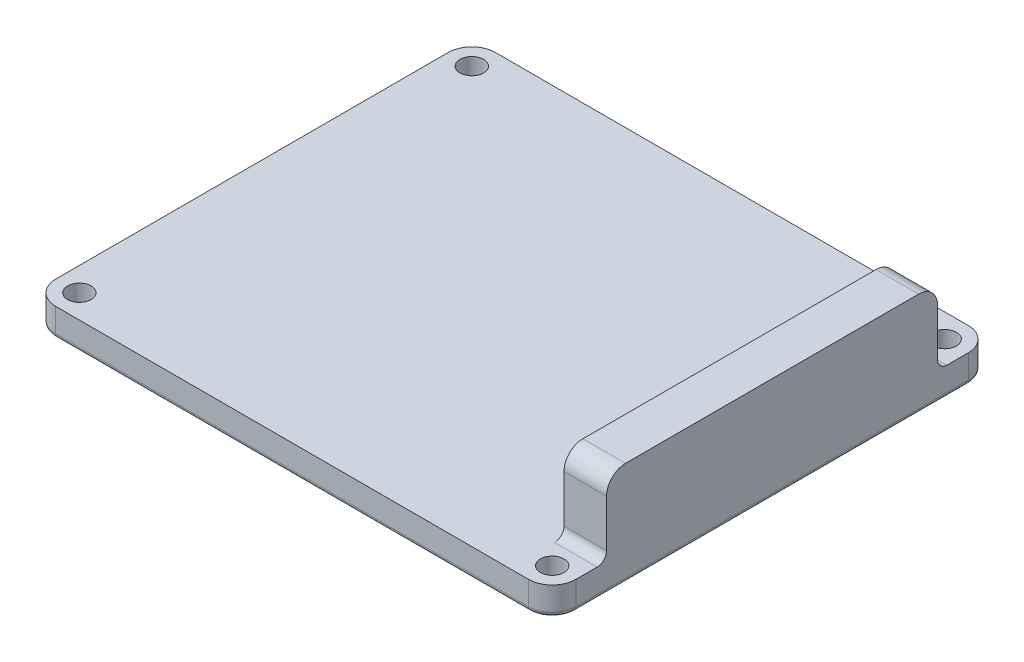
ISO-10303-21;
HEADER;
FILE_DESCRIPTION(('STEP AP214'),'2;1');
FILE_NAME('part.step','',(''),(''),'','','');
FILE_SCHEMA(('AUTOMOTIVE_DESIGN { 1 0 10303 214 1 1 1 1 }'));
ENDSEC;
DATA;
#1=APPLICATION_CONTEXT('core data for automotive mechanical design processes');
#2=APPLICATION_PROTOCOL_DEFINITION('international standard','automotive_design',2000,#1);
#3=PRODUCT_CONTEXT('',#1,'mechanical');
#4=PRODUCT('Part','Part','',(#3));
#5=PRODUCT_RELATED_PRODUCT_CATEGORY('part','',(#4));
#6=PRODUCT_DEFINITION_FORMATION('','',#4);
#7=PRODUCT_DEFINITION_CONTEXT('part definition',#1,'design');
#8=PRODUCT_DEFINITION('design','',#6,#7);
#9=PRODUCT_DEFINITION_SHAPE('','',#8);
#10=(LENGTH_UNIT() NAMED_UNIT(*) SI_UNIT(.MILLI.,.METRE.));
#11=(NAMED_UNIT(*) PLANE_ANGLE_UNIT() SI_UNIT($,.RADIAN.));
#12=(NAMED_UNIT(*) SI_UNIT($,.STERADIAN.) SOLID_ANGLE_UNIT());
#13=UNCERTAINTY_MEASURE_WITH_UNIT(LENGTH_MEASURE(1.E-05),#10,'distance_accuracy_value','');
#14=(GEOMETRIC_REPRESENTATION_CONTEXT(3) GLOBAL_UNCERTAINTY_ASSIGNED_CONTEXT((#13)) GLOBAL_UNIT_ASSIGNED_CONTEXT((#10,
#11,#12)) REPRESENTATION_CONTEXT('',''));
#15=CARTESIAN_POINT('',(0.,0.,0.));
#16=DIRECTION('',(0.,0.,1.));
#17=DIRECTION('',(1.,0.,0.));
#18=AXIS2_PLACEMENT_3D('',#15,#16,#17);
#19=CARTESIAN_POINT('',(-25.,3.,20.75));
#20=DIRECTION('',(0.,1.,0.));
#21=DIRECTION('',(0.,0.,1.));
#22=AXIS2_PLACEMENT_3D('',#19,#20,#21);
#23=PLANE('',#22);
#24=DIRECTION('',(0.,0.,1.));
#25=VECTOR('',#24,1.);
#26=CARTESIAN_POINT('',(23.,3.,-17.5));
#27=LINE('',#26,#25);
#28=CARTESIAN_POINT('',(23.,3.,-18.5));
#29=VERTEX_POINT('',#28);
#30=CARTESIAN_POINT('',(23.,3.,18.5));
#31=VERTEX_POINT('',#30);
#32=EDGE_CURVE('E339',#29,#31,#27,.T.);
#33=ORIENTED_EDGE('',*,*,#32,.F.);
#34=DIRECTION('',(-1.,0.,0.));
#35=VECTOR('',#34,1.);
#36=CARTESIAN_POINT('',(-25.,3.,-18.5));
#37=LINE('',#36,#35);
#38=CARTESIAN_POINT('',(27.5,3.,-18.5));
#39=VERTEX_POINT('',#38);
#40=EDGE_CURVE('E229',#29,#39,#37,.F.);
#41=ORIENTED_EDGE('',*,*,#40,.T.);
#42=DIRECTION('',(0.,0.,-1.));
#43=VECTOR('',#42,1.);
#44=CARTESIAN_POINT('',(27.5,3.,20.75));
#45=LINE('',#44,#43);
#46=CARTESIAN_POINT('',(27.5,3.,-20.75));
#47=VERTEX_POINT('',#46);
#48=EDGE_CURVE('E198',#39,#47,#45,.T.);
#49=ORIENTED_EDGE('',*,*,#48,.T.);
#50=CARTESIAN_POINT('',(25.,3.,-20.75));
#51=DIRECTION('',(0.,1.,0.));
#52=DIRECTION('',(0.,0.,1.));
#53=AXIS2_PLACEMENT_3D('',#50,#51,#52);
#54=CIRCLE('',#53,2.5);
#55=CARTESIAN_POINT('',(25.,3.,-23.25));
#56=VERTEX_POINT('',#55);
#57=EDGE_CURVE('E202',#47,#56,#54,.T.);
#58=ORIENTED_EDGE('',*,*,#57,.T.);
#59=DIRECTION('',(-1.,0.,0.));
#60=VECTOR('',#59,1.);
#61=CARTESIAN_POINT('',(25.,3.,-23.25));
#62=LINE('',#61,#60);
#63=CARTESIAN_POINT('',(-25.,3.,-23.25));
#64=VERTEX_POINT('',#63);
#65=EDGE_CURVE('E204',#56,#64,#62,.T.);
#66=ORIENTED_EDGE('',*,*,#65,.T.);
#67=CARTESIAN_POINT('',(-25.,3.,-20.75));
#68=DIRECTION('',(0.,1.,0.));
#69=DIRECTION('',(0.,0.,1.));
#70=AXIS2_PLACEMENT_3D('',#67,#68,#69);
#71=CIRCLE('',#70,2.5);
#72=CARTESIAN_POINT('',(-27.5,3.,-20.75));
#73=VERTEX_POINT('',#72);
#74=EDGE_CURVE('E178',#64,#73,#71,.T.);
#75=ORIENTED_EDGE('',*,*,#74,.T.);
#76=DIRECTION('',(0.,0.,1.));
#77=VECTOR('',#76,1.);
#78=CARTESIAN_POINT('',(-27.5,3.,-19.25));
#79=LINE('',#78,#77);
#80=CARTESIAN_POINT('',(-27.5,3.,20.75));
#81=VERTEX_POINT('',#80);
#82=EDGE_CURVE('E172',#73,#81,#79,.T.);
#83=ORIENTED_EDGE('',*,*,#82,.T.);
#84=CARTESIAN_POINT('',(-25.,3.,20.75));
#85=DIRECTION('',(0.,1.,0.));
#86=DIRECTION('',(0.,0.,1.));
#87=AXIS2_PLACEMENT_3D('',#84,#85,#86);
#88=CIRCLE('',#87,2.5);
#89=CARTESIAN_POINT('',(-25.,3.,23.25));
#90=VERTEX_POINT('',#89);
#91=EDGE_CURVE('E175',#81,#90,#88,.T.);
#92=ORIENTED_EDGE('',*,*,#91,.T.);
#93=DIRECTION('',(1.,0.,0.));
#94=VECTOR('',#93,1.);
#95=CARTESIAN_POINT('',(-25.,3.,23.25));
#96=LINE('',#95,#94);
#97=CARTESIAN_POINT('',(25.,3.,23.25));
#98=VERTEX_POINT('',#97);
#99=EDGE_CURVE('E191',#90,#98,#96,.T.);
#100=ORIENTED_EDGE('',*,*,#99,.T.);
#101=CARTESIAN_POINT('',(25.,3.,20.75));
#102=DIRECTION('',(0.,1.,0.));
#103=DIRECTION('',(0.,0.,1.));
#104=AXIS2_PLACEMENT_3D('',#101,#102,#103);
#105=CIRCLE('',#104,2.5);
#106=CARTESIAN_POINT('',(27.5,3.,20.75));
#107=VERTEX_POINT('',#106);
#108=EDGE_CURVE('E193',#98,#107,#105,.T.);
#109=ORIENTED_EDGE('',*,*,#108,.T.);
#110=CARTESIAN_POINT('',(27.5,3.,18.5));
#111=VERTEX_POINT('',#110);
#112=EDGE_CURVE('E199',#107,#111,#45,.T.);
#113=ORIENTED_EDGE('',*,*,#112,.T.);
#114=DIRECTION('',(1.,0.,0.));
#115=VECTOR('',#114,1.);
#116=CARTESIAN_POINT('',(-25.,3.,18.5));
#117=LINE('',#116,#115);
#118=EDGE_CURVE('E226',#111,#31,#117,.F.);
#119=ORIENTED_EDGE('',*,*,#118,.T.);
#120=EDGE_LOOP('',(#33,#41,#49,#58,#66,#75,#83,#92,#100,#109,#113,#119));
#121=FACE_BOUND('',#120,.T.);
#122=CARTESIAN_POINT('',(25.,3.,-20.75));
#123=DIRECTION('',(0.,1.,0.));
#124=DIRECTION('',(0.,0.,1.));
#125=AXIS2_PLACEMENT_3D('',#122,#123,#124);
#126=CIRCLE('',#125,1.25);
#127=CARTESIAN_POINT('',(25.,3.,-19.5));
#128=VERTEX_POINT('',#127);
#129=EDGE_CURVE('E362',#128,#128,#126,.T.);
#130=ORIENTED_EDGE('',*,*,#129,.F.);
#131=EDGE_LOOP('',(#130));
#132=FACE_BOUND('',#131,.T.);
#133=CARTESIAN_POINT('',(-25.,3.,20.75));
#134=DIRECTION('',(0.,1.,0.));
#135=DIRECTION('',(0.,0.,1.));
#136=AXIS2_PLACEMENT_3D('',#133,#134,#135);
#137=CIRCLE('',#136,1.25);
#138=CARTESIAN_POINT('',(-25.,3.,22.));
#139=VERTEX_POINT('',#138);
#140=EDGE_CURVE('E179',#139,#139,#137,.T.);
#141=ORIENTED_EDGE('',*,*,#140,.F.);
#142=EDGE_LOOP('',(#141));
#143=FACE_BOUND('',#142,.T.);
#144=CARTESIAN_POINT('',(25.,3.,20.75));
#145=DIRECTION('',(0.,1.,0.));
#146=DIRECTION('',(0.,0.,1.));
#147=AXIS2_PLACEMENT_3D('',#144,#145,#146);
#148=CIRCLE('',#147,1.25);
#149=CARTESIAN_POINT('',(25.,3.,22.));
#150=VERTEX_POINT('',#149);
#151=EDGE_CURVE('E365',#150,#150,#148,.T.);
#152=ORIENTED_EDGE('',*,*,#151,.F.);
#153=EDGE_LOOP('',(#152));
#154=FACE_BOUND('',#153,.T.);
#155=CARTESIAN_POINT('',(-25.,3.,-20.75));
#156=DIRECTION('',(0.,1.,0.));
#157=DIRECTION('',(0.,0.,1.));
#158=AXIS2_PLACEMENT_3D('',#155,#156,#157);
#159=CIRCLE('',#158,1.25);
#160=CARTESIAN_POINT('',(-25.,3.,-19.5));
#161=VERTEX_POINT('',#160);
#162=EDGE_CURVE('E359',#161,#161,#159,.T.);
#163=ORIENTED_EDGE('',*,*,#162,.F.);
#164=EDGE_LOOP('',(#163));
#165=FACE_BOUND('',#164,.T.);
#166=ADVANCED_FACE('F33',(#121,#132,#143,#154,#165),#23,.T.);
#167=CARTESIAN_POINT('',(-25.,0.,20.75));
#168=DIRECTION('',(0.,1.,0.));
#169=DIRECTION('',(0.,0.,1.));
#170=AXIS2_PLACEMENT_3D('',#167,#168,#169);
#171=PLANE('',#170);
#172=CARTESIAN_POINT('',(-25.,0.,-20.75));
#173=DIRECTION('',(0.,1.,0.));
#174=DIRECTION('',(0.,0.,1.));
#175=AXIS2_PLACEMENT_3D('',#172,#173,#174);
#176=CIRCLE('',#175,1.75);
#177=CARTESIAN_POINT('',(-25.,0.,-19.));
#178=VERTEX_POINT('',#177);
#179=EDGE_CURVE('E289',#178,#178,#176,.T.);
#180=ORIENTED_EDGE('',*,*,#179,.T.);
#181=EDGE_LOOP('',(#180));
#182=FACE_BOUND('',#181,.T.);
#183=CARTESIAN_POINT('',(25.,0.,-20.75));
#184=DIRECTION('',(0.,1.,0.));
#185=DIRECTION('',(0.,0.,1.));
#186=AXIS2_PLACEMENT_3D('',#183,#184,#185);
#187=CIRCLE('',#186,1.75);
#188=CARTESIAN_POINT('',(25.,0.,-19.));
#189=VERTEX_POINT('',#188);
#190=EDGE_CURVE('E286',#189,#189,#187,.T.);
#191=ORIENTED_EDGE('',*,*,#190,.T.);
#192=EDGE_LOOP('',(#191));
#193=FACE_BOUND('',#192,.T.);
#194=CARTESIAN_POINT('',(25.,0.,20.75));
#195=DIRECTION('',(0.,1.,0.));
#196=DIRECTION('',(0.,0.,1.));
#197=AXIS2_PLACEMENT_3D('',#194,#195,#196);
#198=CIRCLE('',#197,1.75);
#199=CARTESIAN_POINT('',(25.,0.,22.5));
#200=VERTEX_POINT('',#199);
#201=EDGE_CURVE('E283',#200,#200,#198,.T.);
#202=ORIENTED_EDGE('',*,*,#201,.T.);
#203=EDGE_LOOP('',(#202));
#204=FACE_BOUND('',#203,.T.);
#205=CARTESIAN_POINT('',(-25.,0.,20.75));
#206=DIRECTION('',(0.,1.,0.));
#207=DIRECTION('',(0.,0.,1.));
#208=AXIS2_PLACEMENT_3D('',#205,#206,#207);
#209=CIRCLE('',#208,1.75);
#210=CARTESIAN_POINT('',(-25.,0.,22.5));
#211=VERTEX_POINT('',#210);
#212=EDGE_CURVE('E280',#211,#211,#209,.T.);
#213=ORIENTED_EDGE('',*,*,#212,.T.);
#214=EDGE_LOOP('',(#213));
#215=FACE_BOUND('',#214,.T.);
#216=CARTESIAN_POINT('',(25.,0.,20.75));
#217=DIRECTION('',(0.,1.,0.));
#218=DIRECTION('',(0.,0.,1.));
#219=AXIS2_PLACEMENT_3D('',#216,#217,#218);
#220=CIRCLE('',#219,2.);
#221=CARTESIAN_POINT('',(27.,0.,20.75));
#222=VERTEX_POINT('',#221);
#223=CARTESIAN_POINT('',(25.,0.,22.75));
#224=VERTEX_POINT('',#223);
#225=EDGE_CURVE('E275',#222,#224,#220,.F.);
#226=ORIENTED_EDGE('',*,*,#225,.T.);
#227=DIRECTION('',(1.,0.,0.));
#228=VECTOR('',#227,1.);
#229=CARTESIAN_POINT('',(-25.,0.,22.75));
#230=LINE('',#229,#228);
#231=CARTESIAN_POINT('',(-25.,0.,22.75));
#232=VERTEX_POINT('',#231);
#233=EDGE_CURVE('E277',#224,#232,#230,.F.);
#234=ORIENTED_EDGE('',*,*,#233,.T.);
#235=CARTESIAN_POINT('',(-25.,0.,20.75));
#236=DIRECTION('',(0.,1.,0.));
#237=DIRECTION('',(0.,0.,1.));
#238=AXIS2_PLACEMENT_3D('',#235,#236,#237);
#239=CIRCLE('',#238,2.);
#240=CARTESIAN_POINT('',(-27.,0.,20.75));
#241=VERTEX_POINT('',#240);
#242=EDGE_CURVE('E263',#232,#241,#239,.F.);
#243=ORIENTED_EDGE('',*,*,#242,.T.);
#244=DIRECTION('',(0.,0.,1.));
#245=VECTOR('',#244,1.);
#246=CARTESIAN_POINT('',(-27.,0.,20.75));
#247=LINE('',#246,#245);
#248=CARTESIAN_POINT('',(-27.,0.,-20.75));
#249=VERTEX_POINT('',#248);
#250=EDGE_CURVE('E265',#241,#249,#247,.F.);
#251=ORIENTED_EDGE('',*,*,#250,.T.);
#252=CARTESIAN_POINT('',(-25.,0.,-20.75));
#253=DIRECTION('',(0.,1.,0.));
#254=DIRECTION('',(0.,0.,1.));
#255=AXIS2_PLACEMENT_3D('',#252,#253,#254);
#256=CIRCLE('',#255,2.);
#257=CARTESIAN_POINT('',(-25.,0.,-22.75));
#258=VERTEX_POINT('',#257);
#259=EDGE_CURVE('E267',#249,#258,#256,.F.);
#260=ORIENTED_EDGE('',*,*,#259,.T.);
#261=DIRECTION('',(-1.,0.,0.));
#262=VECTOR('',#261,1.);
#263=CARTESIAN_POINT('',(-25.,0.,-22.75));
#264=LINE('',#263,#262);
#265=CARTESIAN_POINT('',(25.,0.,-22.75));
#266=VERTEX_POINT('',#265);
#267=EDGE_CURVE('E269',#258,#266,#264,.F.);
#268=ORIENTED_EDGE('',*,*,#267,.T.);
#269=CARTESIAN_POINT('',(25.,0.,-20.75));
#270=DIRECTION('',(0.,1.,0.));
#271=DIRECTION('',(0.,0.,1.));
#272=AXIS2_PLACEMENT_3D('',#269,#270,#271);
#273=CIRCLE('',#272,2.);
#274=CARTESIAN_POINT('',(27.,0.,-20.75));
#275=VERTEX_POINT('',#274);
#276=EDGE_CURVE('E271',#266,#275,#273,.F.);
#277=ORIENTED_EDGE('',*,*,#276,.T.);
#278=DIRECTION('',(0.,0.,-1.));
#279=VECTOR('',#278,1.);
#280=CARTESIAN_POINT('',(27.,0.,20.75));
#281=LINE('',#280,#279);
#282=EDGE_CURVE('E273',#275,#222,#281,.F.);
#283=ORIENTED_EDGE('',*,*,#282,.T.);
#284=EDGE_LOOP('',(#226,#234,#243,#251,#260,#268,#277,#283));
#285=FACE_BOUND('',#284,.T.);
#286=ADVANCED_FACE('F374',(#182,#193,#204,#215,#285),#171,.F.);
#287=CARTESIAN_POINT('',(-25.,3.,20.75));
#288=DIRECTION('',(0.,-1.,0.));
#289=DIRECTION('',(0.,0.,-1.));
#290=AXIS2_PLACEMENT_3D('',#287,#288,#289);
#291=CYLINDRICAL_SURFACE('',#290,2.5);
#292=DIRECTION('',(0.,-1.,0.));
#293=VECTOR('',#292,1.);
#294=CARTESIAN_POINT('',(-27.5,3.,20.75));
#295=LINE('',#294,#293);
#296=CARTESIAN_POINT('',(-27.5,0.5,20.75));
#297=VERTEX_POINT('',#296);
#298=EDGE_CURVE('E181',#81,#297,#295,.T.);
#299=ORIENTED_EDGE('',*,*,#298,.T.);
#300=CARTESIAN_POINT('',(-25.,0.5,20.75));
#301=DIRECTION('',(0.,1.,0.));
#302=DIRECTION('',(0.,0.,1.));
#303=AXIS2_PLACEMENT_3D('',#300,#301,#302);
#304=CIRCLE('',#303,2.5);
#305=CARTESIAN_POINT('',(-25.,0.5,23.25));
#306=VERTEX_POINT('',#305);
#307=EDGE_CURVE('E11',#297,#306,#304,.T.);
#308=ORIENTED_EDGE('',*,*,#307,.T.);
#309=DIRECTION('',(0.,-1.,0.));
#310=VECTOR('',#309,1.);
#311=CARTESIAN_POINT('',(-25.,3.,23.25));
#312=LINE('',#311,#310);
#313=EDGE_CURVE('E186',#90,#306,#312,.T.);
#314=ORIENTED_EDGE('',*,*,#313,.F.);
#315=ORIENTED_EDGE('',*,*,#91,.F.);
#316=EDGE_LOOP('',(#299,#308,#314,#315));
#317=FACE_BOUND('',#316,.T.);
#318=ADVANCED_FACE('F188',(#317),#291,.T.);
#319=CARTESIAN_POINT('',(-25.,3.,23.25));
#320=DIRECTION('',(0.,0.,-1.));
#321=DIRECTION('',(-1.,0.,0.));
#322=AXIS2_PLACEMENT_3D('',#319,#320,#321);
#323=PLANE('',#322);
#324=ORIENTED_EDGE('',*,*,#313,.T.);
#325=DIRECTION('',(1.,0.,0.));
#326=VECTOR('',#325,1.);
#327=CARTESIAN_POINT('',(-25.,0.5,23.25));
#328=LINE('',#327,#326);
#329=CARTESIAN_POINT('',(25.,0.5,23.25));
#330=VERTEX_POINT('',#329);
#331=EDGE_CURVE('E304',#306,#330,#328,.T.);
#332=ORIENTED_EDGE('',*,*,#331,.T.);
#333=DIRECTION('',(0.,-1.,0.));
#334=VECTOR('',#333,1.);
#335=CARTESIAN_POINT('',(25.,3.,23.25));
#336=LINE('',#335,#334);
#337=EDGE_CURVE('E220',#98,#330,#336,.T.);
#338=ORIENTED_EDGE('',*,*,#337,.F.);
#339=ORIENTED_EDGE('',*,*,#99,.F.);
#340=EDGE_LOOP('',(#324,#332,#338,#339));
#341=FACE_BOUND('',#340,.T.);
#342=ADVANCED_FACE('F428',(#341),#323,.F.);
#343=CARTESIAN_POINT('',(25.,3.,20.75));
#344=DIRECTION('',(0.,-1.,0.));
#345=DIRECTION('',(0.,0.,-1.));
#346=AXIS2_PLACEMENT_3D('',#343,#344,#345);
#347=CYLINDRICAL_SURFACE('',#346,2.5);
#348=ORIENTED_EDGE('',*,*,#337,.T.);
#349=CARTESIAN_POINT('',(25.,0.5,20.75));
#350=DIRECTION('',(0.,1.,0.));
#351=DIRECTION('',(0.,0.,1.));
#352=AXIS2_PLACEMENT_3D('',#349,#350,#351);
#353=CIRCLE('',#352,2.5);
#354=CARTESIAN_POINT('',(27.5,0.5,20.75));
#355=VERTEX_POINT('',#354);
#356=EDGE_CURVE('E307',#330,#355,#353,.T.);
#357=ORIENTED_EDGE('',*,*,#356,.T.);
#358=DIRECTION('',(0.,-1.,0.));
#359=VECTOR('',#358,1.);
#360=CARTESIAN_POINT('',(27.5,3.,20.75));
#361=LINE('',#360,#359);
#362=EDGE_CURVE('E217',#107,#355,#361,.T.);
#363=ORIENTED_EDGE('',*,*,#362,.F.);
#364=ORIENTED_EDGE('',*,*,#108,.F.);
#365=EDGE_LOOP('',(#348,#357,#363,#364));
#366=FACE_BOUND('',#365,.T.);
#367=ADVANCED_FACE('F424',(#366),#347,.T.);
#368=CARTESIAN_POINT('',(27.5,3.,20.75));
#369=DIRECTION('',(-1.,0.,0.));
#370=DIRECTION('',(0.,0.,1.));
#371=AXIS2_PLACEMENT_3D('',#368,#369,#370);
#372=PLANE('',#371);
#373=ORIENTED_EDGE('',*,*,#362,.T.);
#374=DIRECTION('',(0.,0.,-1.));
#375=VECTOR('',#374,1.);
#376=CARTESIAN_POINT('',(27.5,0.5,20.75));
#377=LINE('',#376,#375);
#378=CARTESIAN_POINT('',(27.5,0.5,-20.75));
#379=VERTEX_POINT('',#378);
#380=EDGE_CURVE('E309',#355,#379,#377,.T.);
#381=ORIENTED_EDGE('',*,*,#380,.T.);
#382=DIRECTION('',(0.,-1.,0.));
#383=VECTOR('',#382,1.);
#384=CARTESIAN_POINT('',(27.5,3.,-20.75));
#385=LINE('',#384,#383);
#386=EDGE_CURVE('E214',#47,#379,#385,.T.);
#387=ORIENTED_EDGE('',*,*,#386,.F.);
#388=ORIENTED_EDGE('',*,*,#48,.F.);
#389=CARTESIAN_POINT('',(27.5,4.,-18.5));
#390=DIRECTION('',(-1.,0.,0.));
#391=DIRECTION('',(0.,0.,1.));
#392=AXIS2_PLACEMENT_3D('',#389,#390,#391);
#393=CIRCLE('',#392,1.);
#394=CARTESIAN_POINT('',(27.5,4.,-17.5));
#395=VERTEX_POINT('',#394);
#396=EDGE_CURVE('E237',#39,#395,#393,.T.);
#397=ORIENTED_EDGE('',*,*,#396,.T.);
#398=DIRECTION('',(0.,-1.,0.));
#399=VECTOR('',#398,1.);
#400=CARTESIAN_POINT('',(27.5,11.,-17.5));
#401=LINE('',#400,#399);
#402=CARTESIAN_POINT('',(27.5,9.,-17.5));
#403=VERTEX_POINT('',#402);
#404=EDGE_CURVE('E357',#403,#395,#401,.T.);
#405=ORIENTED_EDGE('',*,*,#404,.F.);
#406=CARTESIAN_POINT('',(27.5,9.,-15.5));
#407=DIRECTION('',(-1.,0.,0.));
#408=DIRECTION('',(0.,0.,1.));
#409=AXIS2_PLACEMENT_3D('',#406,#407,#408);
#410=CIRCLE('',#409,2.);
#411=CARTESIAN_POINT('',(27.5,11.,-15.5));
#412=VERTEX_POINT('',#411);
#413=EDGE_CURVE('E251',#403,#412,#410,.F.);
#414=ORIENTED_EDGE('',*,*,#413,.T.);
#415=DIRECTION('',(0.,0.,-1.));
#416=VECTOR('',#415,1.);
#417=CARTESIAN_POINT('',(27.5,11.,-17.5));
#418=LINE('',#417,#416);
#419=CARTESIAN_POINT('',(27.5,11.,15.5));
#420=VERTEX_POINT('',#419);
#421=EDGE_CURVE('E343',#420,#412,#418,.T.);
#422=ORIENTED_EDGE('',*,*,#421,.F.);
#423=CARTESIAN_POINT('',(27.5,9.,15.5));
#424=DIRECTION('',(-1.,0.,0.));
#425=DIRECTION('',(0.,0.,1.));
#426=AXIS2_PLACEMENT_3D('',#423,#424,#425);
#427=CIRCLE('',#426,2.);
#428=CARTESIAN_POINT('',(27.5,9.,17.5));
#429=VERTEX_POINT('',#428);
#430=EDGE_CURVE('E253',#420,#429,#427,.F.);
#431=ORIENTED_EDGE('',*,*,#430,.T.);
#432=DIRECTION('',(0.,-1.,0.));
#433=VECTOR('',#432,1.);
#434=CARTESIAN_POINT('',(27.5,11.,17.5));
#435=LINE('',#434,#433);
#436=CARTESIAN_POINT('',(27.5,4.,17.5));
#437=VERTEX_POINT('',#436);
#438=EDGE_CURVE('E351',#429,#437,#435,.T.);
#439=ORIENTED_EDGE('',*,*,#438,.T.);
#440=CARTESIAN_POINT('',(27.5,4.,18.5));
#441=DIRECTION('',(-1.,0.,0.));
#442=DIRECTION('',(0.,0.,1.));
#443=AXIS2_PLACEMENT_3D('',#440,#441,#442);
#444=CIRCLE('',#443,1.);
#445=EDGE_CURVE('E240',#437,#111,#444,.T.);
#446=ORIENTED_EDGE('',*,*,#445,.T.);
#447=ORIENTED_EDGE('',*,*,#112,.F.);
#448=EDGE_LOOP('',(#373,#381,#387,#388,#397,#405,#414,#422,#431,#439,#446,#447));
#449=FACE_BOUND('',#448,.T.);
#450=ADVANCED_FACE('F420',(#449),#372,.F.);
#451=CARTESIAN_POINT('',(25.,3.,-20.75));
#452=DIRECTION('',(0.,-1.,0.));
#453=DIRECTION('',(0.,0.,-1.));
#454=AXIS2_PLACEMENT_3D('',#451,#452,#453);
#455=CYLINDRICAL_SURFACE('',#454,2.5);
#456=ORIENTED_EDGE('',*,*,#386,.T.);
#457=CARTESIAN_POINT('',(25.,0.5,-20.75));
#458=DIRECTION('',(0.,1.,0.));
#459=DIRECTION('',(0.,0.,1.));
#460=AXIS2_PLACEMENT_3D('',#457,#458,#459);
#461=CIRCLE('',#460,2.5);
#462=CARTESIAN_POINT('',(25.,0.5,-23.25));
#463=VERTEX_POINT('',#462);
#464=EDGE_CURVE('E311',#379,#463,#461,.T.);
#465=ORIENTED_EDGE('',*,*,#464,.T.);
#466=DIRECTION('',(0.,-1.,0.));
#467=VECTOR('',#466,1.);
#468=CARTESIAN_POINT('',(25.,3.,-23.25));
#469=LINE('',#468,#467);
#470=EDGE_CURVE('E211',#56,#463,#469,.T.);
#471=ORIENTED_EDGE('',*,*,#470,.F.);
#472=ORIENTED_EDGE('',*,*,#57,.F.);
#473=EDGE_LOOP('',(#456,#465,#471,#472));
#474=FACE_BOUND('',#473,.T.);
#475=ADVANCED_FACE('F416',(#474),#455,.T.);
#476=CARTESIAN_POINT('',(25.,3.,-23.25));
#477=DIRECTION('',(0.,0.,1.));
#478=DIRECTION('',(1.,0.,0.));
#479=AXIS2_PLACEMENT_3D('',#476,#477,#478);
#480=PLANE('',#479);
#481=ORIENTED_EDGE('',*,*,#470,.T.);
#482=DIRECTION('',(-1.,0.,0.));
#483=VECTOR('',#482,1.);
#484=CARTESIAN_POINT('',(25.,0.5,-23.25));
#485=LINE('',#484,#483);
#486=CARTESIAN_POINT('',(-25.,0.5,-23.25));
#487=VERTEX_POINT('',#486);
#488=EDGE_CURVE('E313',#463,#487,#485,.T.);
#489=ORIENTED_EDGE('',*,*,#488,.T.);
#490=DIRECTION('',(0.,-1.,0.));
#491=VECTOR('',#490,1.);
#492=CARTESIAN_POINT('',(-25.,3.,-23.25));
#493=LINE('',#492,#491);
#494=EDGE_CURVE('E209',#64,#487,#493,.T.);
#495=ORIENTED_EDGE('',*,*,#494,.F.);
#496=ORIENTED_EDGE('',*,*,#65,.F.);
#497=EDGE_LOOP('',(#481,#489,#495,#496));
#498=FACE_BOUND('',#497,.T.);
#499=ADVANCED_FACE('F413',(#498),#480,.F.);
#500=CARTESIAN_POINT('',(-25.,3.,-20.75));
#501=DIRECTION('',(0.,-1.,0.));
#502=DIRECTION('',(0.,0.,-1.));
#503=AXIS2_PLACEMENT_3D('',#500,#501,#502);
#504=CYLINDRICAL_SURFACE('',#503,2.5);
#505=ORIENTED_EDGE('',*,*,#494,.T.);
#506=CARTESIAN_POINT('',(-25.,0.5,-20.75));
#507=DIRECTION('',(0.,1.,0.));
#508=DIRECTION('',(0.,0.,1.));
#509=AXIS2_PLACEMENT_3D('',#506,#507,#508);
#510=CIRCLE('',#509,2.5);
#511=CARTESIAN_POINT('',(-27.5,0.5,-20.75));
#512=VERTEX_POINT('',#511);
#513=EDGE_CURVE('E57',#487,#512,#510,.T.);
#514=ORIENTED_EDGE('',*,*,#513,.T.);
#515=DIRECTION('',(0.,-1.,0.));
#516=VECTOR('',#515,1.);
#517=CARTESIAN_POINT('',(-27.5,3.,-20.75));
#518=LINE('',#517,#516);
#519=EDGE_CURVE('E207',#73,#512,#518,.T.);
#520=ORIENTED_EDGE('',*,*,#519,.F.);
#521=ORIENTED_EDGE('',*,*,#74,.F.);
#522=EDGE_LOOP('',(#505,#514,#520,#521));
#523=FACE_BOUND('',#522,.T.);
#524=ADVANCED_FACE('F410',(#523),#504,.T.);
#525=CARTESIAN_POINT('',(-27.5,3.,-20.75));
#526=DIRECTION('',(1.,0.,0.));
#527=DIRECTION('',(0.,0.,-1.));
#528=AXIS2_PLACEMENT_3D('',#525,#526,#527);
#529=PLANE('',#528);
#530=ORIENTED_EDGE('',*,*,#519,.T.);
#531=DIRECTION('',(0.,0.,1.));
#532=VECTOR('',#531,1.);
#533=CARTESIAN_POINT('',(-27.5,0.5,-20.75));
#534=LINE('',#533,#532);
#535=EDGE_CURVE('E42',#512,#297,#534,.T.);
#536=ORIENTED_EDGE('',*,*,#535,.T.);
#537=ORIENTED_EDGE('',*,*,#298,.F.);
#538=ORIENTED_EDGE('',*,*,#82,.F.);
#539=EDGE_LOOP('',(#530,#536,#537,#538));
#540=FACE_BOUND('',#539,.T.);
#541=ADVANCED_FACE('F182',(#540),#529,.F.);
#542=CARTESIAN_POINT('',(-25.,3.,20.75));
#543=DIRECTION('',(0.,-1.,0.));
#544=DIRECTION('',(0.,0.,-1.));
#545=AXIS2_PLACEMENT_3D('',#542,#543,#544);
#546=CYLINDRICAL_SURFACE('',#545,1.25);
#547=CARTESIAN_POINT('',(-25.,0.5,20.75));
#548=DIRECTION('',(0.,1.,0.));
#549=DIRECTION('',(0.,0.,1.));
#550=AXIS2_PLACEMENT_3D('',#547,#548,#549);
#551=CIRCLE('',#550,1.25);
#552=CARTESIAN_POINT('',(-25.,0.5,22.));
#553=VERTEX_POINT('',#552);
#554=EDGE_CURVE('E301',#553,#553,#551,.F.);
#555=ORIENTED_EDGE('',*,*,#554,.T.);
#556=EDGE_LOOP('',(#555));
#557=FACE_BOUND('',#556,.T.);
#558=ORIENTED_EDGE('',*,*,#140,.T.);
#559=EDGE_LOOP('',(#558));
#560=FACE_BOUND('',#559,.T.);
#561=ADVANCED_FACE('F370',(#557,#560),#546,.F.);
#562=CARTESIAN_POINT('',(25.,3.,20.75));
#563=DIRECTION('',(0.,-1.,0.));
#564=DIRECTION('',(0.,0.,-1.));
#565=AXIS2_PLACEMENT_3D('',#562,#563,#564);
#566=CYLINDRICAL_SURFACE('',#565,1.25);
#567=CARTESIAN_POINT('',(25.,0.5,20.75));
#568=DIRECTION('',(0.,1.,0.));
#569=DIRECTION('',(0.,0.,1.));
#570=AXIS2_PLACEMENT_3D('',#567,#568,#569);
#571=CIRCLE('',#570,1.25);
#572=CARTESIAN_POINT('',(25.,0.5,22.));
#573=VERTEX_POINT('',#572);
#574=EDGE_CURVE('E298',#573,#573,#571,.F.);
#575=ORIENTED_EDGE('',*,*,#574,.T.);
#576=EDGE_LOOP('',(#575));
#577=FACE_BOUND('',#576,.T.);
#578=ORIENTED_EDGE('',*,*,#151,.T.);
#579=EDGE_LOOP('',(#578));
#580=FACE_BOUND('',#579,.T.);
#581=ADVANCED_FACE('F394',(#577,#580),#566,.F.);
#582=CARTESIAN_POINT('',(25.,3.,-20.75));
#583=DIRECTION('',(0.,-1.,0.));
#584=DIRECTION('',(0.,0.,-1.));
#585=AXIS2_PLACEMENT_3D('',#582,#583,#584);
#586=CYLINDRICAL_SURFACE('',#585,1.25);
#587=CARTESIAN_POINT('',(25.,0.5,-20.75));
#588=DIRECTION('',(0.,1.,0.));
#589=DIRECTION('',(0.,0.,1.));
#590=AXIS2_PLACEMENT_3D('',#587,#588,#589);
#591=CIRCLE('',#590,1.25);
#592=CARTESIAN_POINT('',(25.,0.5,-19.5));
#593=VERTEX_POINT('',#592);
#594=EDGE_CURVE('E295',#593,#593,#591,.F.);
#595=ORIENTED_EDGE('',*,*,#594,.T.);
#596=EDGE_LOOP('',(#595));
#597=FACE_BOUND('',#596,.T.);
#598=ORIENTED_EDGE('',*,*,#129,.T.);
#599=EDGE_LOOP('',(#598));
#600=FACE_BOUND('',#599,.T.);
#601=ADVANCED_FACE('F383',(#597,#600),#586,.F.);
#602=CARTESIAN_POINT('',(-25.,3.,-20.75));
#603=DIRECTION('',(0.,-1.,0.));
#604=DIRECTION('',(0.,0.,-1.));
#605=AXIS2_PLACEMENT_3D('',#602,#603,#604);
#606=CYLINDRICAL_SURFACE('',#605,1.25);
#607=CARTESIAN_POINT('',(-25.,0.5,-20.75));
#608=DIRECTION('',(0.,1.,0.));
#609=DIRECTION('',(0.,0.,1.));
#610=AXIS2_PLACEMENT_3D('',#607,#608,#609);
#611=CIRCLE('',#610,1.25);
#612=CARTESIAN_POINT('',(-25.,0.5,-19.5));
#613=VERTEX_POINT('',#612);
#614=EDGE_CURVE('E292',#613,#613,#611,.F.);
#615=ORIENTED_EDGE('',*,*,#614,.T.);
#616=EDGE_LOOP('',(#615));
#617=FACE_BOUND('',#616,.T.);
#618=ORIENTED_EDGE('',*,*,#162,.T.);
#619=EDGE_LOOP('',(#618));
#620=FACE_BOUND('',#619,.T.);
#621=ADVANCED_FACE('F380',(#617,#620),#606,.F.);
#622=CARTESIAN_POINT('',(27.5,11.,-17.5));
#623=DIRECTION('',(0.,0.,1.));
#624=DIRECTION('',(1.,0.,0.));
#625=AXIS2_PLACEMENT_3D('',#622,#623,#624);
#626=PLANE('',#625);
#627=DIRECTION('',(0.,-1.,0.));
#628=VECTOR('',#627,1.);
#629=CARTESIAN_POINT('',(23.,11.,-17.5));
#630=LINE('',#629,#628);
#631=CARTESIAN_POINT('',(23.,9.,-17.5));
#632=VERTEX_POINT('',#631);
#633=CARTESIAN_POINT('',(23.,4.,-17.5));
#634=VERTEX_POINT('',#633);
#635=EDGE_CURVE('E355',#632,#634,#630,.T.);
#636=ORIENTED_EDGE('',*,*,#635,.F.);
#637=DIRECTION('',(-1.,0.,0.));
#638=VECTOR('',#637,1.);
#639=CARTESIAN_POINT('',(27.5,9.,-17.5));
#640=LINE('',#639,#638);
#641=EDGE_CURVE('E261',#632,#403,#640,.F.);
#642=ORIENTED_EDGE('',*,*,#641,.T.);
#643=ORIENTED_EDGE('',*,*,#404,.T.);
#644=DIRECTION('',(-1.,0.,0.));
#645=VECTOR('',#644,1.);
#646=CARTESIAN_POINT('',(27.5,4.,-17.5));
#647=LINE('',#646,#645);
#648=EDGE_CURVE('E185',#395,#634,#647,.T.);
#649=ORIENTED_EDGE('',*,*,#648,.T.);
#650=EDGE_LOOP('',(#636,#642,#643,#649));
#651=FACE_BOUND('',#650,.T.);
#652=ADVANCED_FACE('F382',(#651),#626,.F.);
#653=CARTESIAN_POINT('',(23.,11.,-17.5));
#654=DIRECTION('',(1.,0.,0.));
#655=DIRECTION('',(0.,0.,-1.));
#656=AXIS2_PLACEMENT_3D('',#653,#654,#655);
#657=PLANE('',#656);
#658=DIRECTION('',(0.,-1.,0.));
#659=VECTOR('',#658,1.);
#660=CARTESIAN_POINT('',(23.,11.,17.5));
#661=LINE('',#660,#659);
#662=CARTESIAN_POINT('',(23.,9.,17.5));
#663=VERTEX_POINT('',#662);
#664=CARTESIAN_POINT('',(23.,4.,17.5));
#665=VERTEX_POINT('',#664);
#666=EDGE_CURVE('E353',#663,#665,#661,.T.);
#667=ORIENTED_EDGE('',*,*,#666,.F.);
#668=CARTESIAN_POINT('',(23.,9.,15.5));
#669=DIRECTION('',(1.,0.,0.));
#670=DIRECTION('',(0.,0.,-1.));
#671=AXIS2_PLACEMENT_3D('',#668,#669,#670);
#672=CIRCLE('',#671,2.);
#673=CARTESIAN_POINT('',(23.,11.,15.5));
#674=VERTEX_POINT('',#673);
#675=EDGE_CURVE('E259',#663,#674,#672,.F.);
#676=ORIENTED_EDGE('',*,*,#675,.T.);
#677=DIRECTION('',(0.,0.,1.));
#678=VECTOR('',#677,1.);
#679=CARTESIAN_POINT('',(23.,11.,-17.5));
#680=LINE('',#679,#678);
#681=CARTESIAN_POINT('',(23.,11.,-15.5));
#682=VERTEX_POINT('',#681);
#683=EDGE_CURVE('E347',#682,#674,#680,.T.);
#684=ORIENTED_EDGE('',*,*,#683,.F.);
#685=CARTESIAN_POINT('',(23.,9.,-15.5));
#686=DIRECTION('',(1.,0.,0.));
#687=DIRECTION('',(0.,0.,-1.));
#688=AXIS2_PLACEMENT_3D('',#685,#686,#687);
#689=CIRCLE('',#688,2.);
#690=EDGE_CURVE('E257',#682,#632,#689,.F.);
#691=ORIENTED_EDGE('',*,*,#690,.T.);
#692=ORIENTED_EDGE('',*,*,#635,.T.);
#693=CARTESIAN_POINT('',(23.,4.,-18.5));
#694=DIRECTION('',(1.,0.,0.));
#695=DIRECTION('',(0.,0.,-1.));
#696=AXIS2_PLACEMENT_3D('',#693,#694,#695);
#697=CIRCLE('',#696,1.);
#698=EDGE_CURVE('E234',#634,#29,#697,.T.);
#699=ORIENTED_EDGE('',*,*,#698,.T.);
#700=ORIENTED_EDGE('',*,*,#32,.T.);
#701=CARTESIAN_POINT('',(23.,4.,18.5));
#702=DIRECTION('',(1.,0.,0.));
#703=DIRECTION('',(0.,0.,-1.));
#704=AXIS2_PLACEMENT_3D('',#701,#702,#703);
#705=CIRCLE('',#704,1.);
#706=EDGE_CURVE('E242',#31,#665,#705,.T.);
#707=ORIENTED_EDGE('',*,*,#706,.T.);
#708=EDGE_LOOP('',(#667,#676,#684,#691,#692,#699,#700,#707));
#709=FACE_BOUND('',#708,.T.);
#710=ADVANCED_FACE('F391',(#709),#657,.F.);
#711=CARTESIAN_POINT('',(27.5,11.,17.5));
#712=DIRECTION('',(0.,0.,-1.));
#713=DIRECTION('',(-1.,0.,0.));
#714=AXIS2_PLACEMENT_3D('',#711,#712,#713);
#715=PLANE('',#714);
#716=ORIENTED_EDGE('',*,*,#438,.F.);
#717=DIRECTION('',(1.,0.,0.));
#718=VECTOR('',#717,1.);
#719=CARTESIAN_POINT('',(27.5,9.,17.5));
#720=LINE('',#719,#718);
#721=EDGE_CURVE('E255',#429,#663,#720,.F.);
#722=ORIENTED_EDGE('',*,*,#721,.T.);
#723=ORIENTED_EDGE('',*,*,#666,.T.);
#724=DIRECTION('',(1.,0.,0.));
#725=VECTOR('',#724,1.);
#726=CARTESIAN_POINT('',(27.5,4.,17.5));
#727=LINE('',#726,#725);
#728=EDGE_CURVE('E231',#665,#437,#727,.T.);
#729=ORIENTED_EDGE('',*,*,#728,.T.);
#730=EDGE_LOOP('',(#716,#722,#723,#729));
#731=FACE_BOUND('',#730,.T.);
#732=ADVANCED_FACE('F522',(#731),#715,.F.);
#733=CARTESIAN_POINT('',(0.,11.,0.));
#734=DIRECTION('',(0.,-1.,0.));
#735=DIRECTION('',(0.,0.,-1.));
#736=AXIS2_PLACEMENT_3D('',#733,#734,#735);
#737=PLANE('',#736);
#738=ORIENTED_EDGE('',*,*,#683,.T.);
#739=DIRECTION('',(1.,0.,0.));
#740=VECTOR('',#739,1.);
#741=CARTESIAN_POINT('',(0.,11.,15.5));
#742=LINE('',#741,#740);
#743=EDGE_CURVE('E248',#674,#420,#742,.T.);
#744=ORIENTED_EDGE('',*,*,#743,.T.);
#745=ORIENTED_EDGE('',*,*,#421,.T.);
#746=DIRECTION('',(-1.,0.,0.));
#747=VECTOR('',#746,1.);
#748=CARTESIAN_POINT('',(0.,11.,-15.5));
#749=LINE('',#748,#747);
#750=EDGE_CURVE('E245',#412,#682,#749,.T.);
#751=ORIENTED_EDGE('',*,*,#750,.T.);
#752=EDGE_LOOP('',(#738,#744,#745,#751));
#753=FACE_BOUND('',#752,.T.);
#754=ADVANCED_FACE('F439',(#753),#737,.F.);
#755=CARTESIAN_POINT('',(27.5,4.,-18.5));
#756=DIRECTION('',(-1.,0.,0.));
#757=DIRECTION('',(0.,0.,1.));
#758=AXIS2_PLACEMENT_3D('',#755,#756,#757);
#759=CYLINDRICAL_SURFACE('',#758,1.);
#760=ORIENTED_EDGE('',*,*,#396,.F.);
#761=ORIENTED_EDGE('',*,*,#40,.F.);
#762=ORIENTED_EDGE('',*,*,#698,.F.);
#763=ORIENTED_EDGE('',*,*,#648,.F.);
#764=EDGE_LOOP('',(#760,#761,#762,#763));
#765=FACE_BOUND('',#764,.T.);
#766=ADVANCED_FACE('F435',(#765),#759,.F.);
#767=CARTESIAN_POINT('',(27.5,4.,18.5));
#768=DIRECTION('',(1.,0.,0.));
#769=DIRECTION('',(0.,0.,-1.));
#770=AXIS2_PLACEMENT_3D('',#767,#768,#769);
#771=CYLINDRICAL_SURFACE('',#770,1.);
#772=ORIENTED_EDGE('',*,*,#706,.F.);
#773=ORIENTED_EDGE('',*,*,#118,.F.);
#774=ORIENTED_EDGE('',*,*,#445,.F.);
#775=ORIENTED_EDGE('',*,*,#728,.F.);
#776=EDGE_LOOP('',(#772,#773,#774,#775));
#777=FACE_BOUND('',#776,.T.);
#778=ADVANCED_FACE('F438',(#777),#771,.F.);
#779=CARTESIAN_POINT('',(0.,9.,15.5));
#780=DIRECTION('',(1.,0.,0.));
#781=DIRECTION('',(0.,0.,-1.));
#782=AXIS2_PLACEMENT_3D('',#779,#780,#781);
#783=CYLINDRICAL_SURFACE('',#782,2.);
#784=ORIENTED_EDGE('',*,*,#675,.F.);
#785=ORIENTED_EDGE('',*,*,#721,.F.);
#786=ORIENTED_EDGE('',*,*,#430,.F.);
#787=ORIENTED_EDGE('',*,*,#743,.F.);
#788=EDGE_LOOP('',(#784,#785,#786,#787));
#789=FACE_BOUND('',#788,.T.);
#790=ADVANCED_FACE('F443',(#789),#783,.T.);
#791=CARTESIAN_POINT('',(0.,9.,-15.5));
#792=DIRECTION('',(-1.,0.,0.));
#793=DIRECTION('',(0.,0.,1.));
#794=AXIS2_PLACEMENT_3D('',#791,#792,#793);
#795=CYLINDRICAL_SURFACE('',#794,2.);
#796=ORIENTED_EDGE('',*,*,#413,.F.);
#797=ORIENTED_EDGE('',*,*,#641,.F.);
#798=ORIENTED_EDGE('',*,*,#690,.F.);
#799=ORIENTED_EDGE('',*,*,#750,.F.);
#800=EDGE_LOOP('',(#796,#797,#798,#799));
#801=FACE_BOUND('',#800,.T.);
#802=ADVANCED_FACE('F447',(#801),#795,.T.);
#803=CARTESIAN_POINT('',(-25.,0.5,-20.75));
#804=DIRECTION('',(0.,1.,0.));
#805=DIRECTION('',(0.,0.,1.));
#806=AXIS2_PLACEMENT_3D('',#803,#804,#805);
#807=TOROIDAL_SURFACE('',#806,1.75,0.5);
#808=ORIENTED_EDGE('',*,*,#614,.F.);
#809=EDGE_LOOP('',(#808));
#810=FACE_BOUND('',#809,.T.);
#811=ORIENTED_EDGE('',*,*,#179,.F.);
#812=EDGE_LOOP('',(#811));
#813=FACE_BOUND('',#812,.T.);
#814=ADVANCED_FACE('F451',(#810,#813),#807,.T.);
#815=CARTESIAN_POINT('',(25.,0.5,-20.75));
#816=DIRECTION('',(0.,1.,0.));
#817=DIRECTION('',(0.,0.,1.));
#818=AXIS2_PLACEMENT_3D('',#815,#816,#817);
#819=TOROIDAL_SURFACE('',#818,1.75,0.5);
#820=ORIENTED_EDGE('',*,*,#594,.F.);
#821=EDGE_LOOP('',(#820));
#822=FACE_BOUND('',#821,.T.);
#823=ORIENTED_EDGE('',*,*,#190,.F.);
#824=EDGE_LOOP('',(#823));
#825=FACE_BOUND('',#824,.T.);
#826=ADVANCED_FACE('F455',(#822,#825),#819,.T.);
#827=CARTESIAN_POINT('',(25.,0.5,20.75));
#828=DIRECTION('',(0.,1.,0.));
#829=DIRECTION('',(0.,0.,1.));
#830=AXIS2_PLACEMENT_3D('',#827,#828,#829);
#831=TOROIDAL_SURFACE('',#830,1.75,0.5);
#832=ORIENTED_EDGE('',*,*,#574,.F.);
#833=EDGE_LOOP('',(#832));
#834=FACE_BOUND('',#833,.T.);
#835=ORIENTED_EDGE('',*,*,#201,.F.);
#836=EDGE_LOOP('',(#835));
#837=FACE_BOUND('',#836,.T.);
#838=ADVANCED_FACE('F459',(#834,#837),#831,.T.);
#839=CARTESIAN_POINT('',(-25.,0.5,20.75));
#840=DIRECTION('',(0.,1.,0.));
#841=DIRECTION('',(0.,0.,1.));
#842=AXIS2_PLACEMENT_3D('',#839,#840,#841);
#843=TOROIDAL_SURFACE('',#842,1.75,0.5);
#844=ORIENTED_EDGE('',*,*,#554,.F.);
#845=EDGE_LOOP('',(#844));
#846=FACE_BOUND('',#845,.T.);
#847=ORIENTED_EDGE('',*,*,#212,.F.);
#848=EDGE_LOOP('',(#847));
#849=FACE_BOUND('',#848,.T.);
#850=ADVANCED_FACE('F463',(#846,#849),#843,.T.);
#851=CARTESIAN_POINT('',(25.,0.5,-22.75));
#852=DIRECTION('',(-1.,0.,0.));
#853=DIRECTION('',(0.,0.,1.));
#854=AXIS2_PLACEMENT_3D('',#851,#852,#853);
#855=CYLINDRICAL_SURFACE('',#854,0.5);
#856=CARTESIAN_POINT('',(25.,0.5,-22.75));
#857=DIRECTION('',(1.,0.,0.));
#858=DIRECTION('',(0.,0.,-1.));
#859=AXIS2_PLACEMENT_3D('',#856,#857,#858);
#860=CIRCLE('',#859,0.5);
#861=EDGE_CURVE('E332',#266,#463,#860,.T.);
#862=ORIENTED_EDGE('',*,*,#861,.F.);
#863=ORIENTED_EDGE('',*,*,#267,.F.);
#864=CARTESIAN_POINT('',(-25.,0.5,-22.75));
#865=DIRECTION('',(-1.,0.,0.));
#866=DIRECTION('',(0.,0.,1.));
#867=AXIS2_PLACEMENT_3D('',#864,#865,#866);
#868=CIRCLE('',#867,0.5);
#869=EDGE_CURVE('E37',#487,#258,#868,.T.);
#870=ORIENTED_EDGE('',*,*,#869,.F.);
#871=ORIENTED_EDGE('',*,*,#488,.F.);
#872=EDGE_LOOP('',(#862,#863,#870,#871));
#873=FACE_BOUND('',#872,.T.);
#874=ADVANCED_FACE('F35',(#873),#855,.T.);
#875=CARTESIAN_POINT('',(-25.,0.5,-20.75));
#876=DIRECTION('',(0.,1.,0.));
#877=DIRECTION('',(0.,0.,1.));
#878=AXIS2_PLACEMENT_3D('',#875,#876,#877);
#879=TOROIDAL_SURFACE('',#878,2.,0.5);
#880=ORIENTED_EDGE('',*,*,#869,.T.);
#881=ORIENTED_EDGE('',*,*,#259,.F.);
#882=CARTESIAN_POINT('',(-27.,0.5,-20.75));
#883=DIRECTION('',(0.,0.,1.));
#884=DIRECTION('',(1.,0.,0.));
#885=AXIS2_PLACEMENT_3D('',#882,#883,#884);
#886=CIRCLE('',#885,0.5);
#887=EDGE_CURVE('E330',#512,#249,#886,.T.);
#888=ORIENTED_EDGE('',*,*,#887,.F.);
#889=ORIENTED_EDGE('',*,*,#513,.F.);
#890=EDGE_LOOP('',(#880,#881,#888,#889));
#891=FACE_BOUND('',#890,.T.);
#892=ADVANCED_FACE('F490',(#891),#879,.T.);
#893=CARTESIAN_POINT('',(25.,0.5,-20.75));
#894=DIRECTION('',(0.,1.,0.));
#895=DIRECTION('',(0.,0.,1.));
#896=AXIS2_PLACEMENT_3D('',#893,#894,#895);
#897=TOROIDAL_SURFACE('',#896,2.,0.5);
#898=ORIENTED_EDGE('',*,*,#861,.T.);
#899=ORIENTED_EDGE('',*,*,#464,.F.);
#900=CARTESIAN_POINT('',(27.,0.5,-20.75));
#901=DIRECTION('',(0.,0.,1.));
#902=DIRECTION('',(1.,0.,0.));
#903=AXIS2_PLACEMENT_3D('',#900,#901,#902);
#904=CIRCLE('',#903,0.5);
#905=EDGE_CURVE('E327',#275,#379,#904,.T.);
#906=ORIENTED_EDGE('',*,*,#905,.F.);
#907=ORIENTED_EDGE('',*,*,#276,.F.);
#908=EDGE_LOOP('',(#898,#899,#906,#907));
#909=FACE_BOUND('',#908,.T.);
#910=ADVANCED_FACE('F487',(#909),#897,.T.);
#911=CARTESIAN_POINT('',(-27.,0.5,-20.75));
#912=DIRECTION('',(0.,0.,1.));
#913=DIRECTION('',(1.,0.,0.));
#914=AXIS2_PLACEMENT_3D('',#911,#912,#913);
#915=CYLINDRICAL_SURFACE('',#914,0.5);
#916=ORIENTED_EDGE('',*,*,#887,.T.);
#917=ORIENTED_EDGE('',*,*,#250,.F.);
#918=CARTESIAN_POINT('',(-27.,0.5,20.75));
#919=DIRECTION('',(0.,0.,1.));
#920=DIRECTION('',(1.,0.,0.));
#921=AXIS2_PLACEMENT_3D('',#918,#919,#920);
#922=CIRCLE('',#921,0.5);
#923=EDGE_CURVE('E324',#297,#241,#922,.T.);
#924=ORIENTED_EDGE('',*,*,#923,.F.);
#925=ORIENTED_EDGE('',*,*,#535,.F.);
#926=EDGE_LOOP('',(#916,#917,#924,#925));
#927=FACE_BOUND('',#926,.T.);
#928=ADVANCED_FACE('F483',(#927),#915,.T.);
#929=CARTESIAN_POINT('',(27.,0.5,20.75));
#930=DIRECTION('',(0.,0.,-1.));
#931=DIRECTION('',(-1.,0.,0.));
#932=AXIS2_PLACEMENT_3D('',#929,#930,#931);
#933=CYLINDRICAL_SURFACE('',#932,0.5);
#934=ORIENTED_EDGE('',*,*,#905,.T.);
#935=ORIENTED_EDGE('',*,*,#380,.F.);
#936=CARTESIAN_POINT('',(27.,0.5,20.75));
#937=DIRECTION('',(0.,0.,1.));
#938=DIRECTION('',(1.,0.,0.));
#939=AXIS2_PLACEMENT_3D('',#936,#937,#938);
#940=CIRCLE('',#939,0.5);
#941=EDGE_CURVE('E321',#222,#355,#940,.T.);
#942=ORIENTED_EDGE('',*,*,#941,.F.);
#943=ORIENTED_EDGE('',*,*,#282,.F.);
#944=EDGE_LOOP('',(#934,#935,#942,#943));
#945=FACE_BOUND('',#944,.T.);
#946=ADVANCED_FACE('F479',(#945),#933,.T.);
#947=CARTESIAN_POINT('',(-25.,0.5,20.75));
#948=DIRECTION('',(0.,1.,0.));
#949=DIRECTION('',(0.,0.,1.));
#950=AXIS2_PLACEMENT_3D('',#947,#948,#949);
#951=TOROIDAL_SURFACE('',#950,2.,0.5);
#952=ORIENTED_EDGE('',*,*,#923,.T.);
#953=ORIENTED_EDGE('',*,*,#242,.F.);
#954=CARTESIAN_POINT('',(-25.,0.5,22.75));
#955=DIRECTION('',(1.,0.,0.));
#956=DIRECTION('',(0.,0.,-1.));
#957=AXIS2_PLACEMENT_3D('',#954,#955,#956);
#958=CIRCLE('',#957,0.5);
#959=EDGE_CURVE('E319',#306,#232,#958,.T.);
#960=ORIENTED_EDGE('',*,*,#959,.F.);
#961=ORIENTED_EDGE('',*,*,#307,.F.);
#962=EDGE_LOOP('',(#952,#953,#960,#961));
#963=FACE_BOUND('',#962,.T.);
#964=ADVANCED_FACE('F475',(#963),#951,.T.);
#965=CARTESIAN_POINT('',(25.,0.5,20.75));
#966=DIRECTION('',(0.,1.,0.));
#967=DIRECTION('',(0.,0.,1.));
#968=AXIS2_PLACEMENT_3D('',#965,#966,#967);
#969=TOROIDAL_SURFACE('',#968,2.,0.5);
#970=ORIENTED_EDGE('',*,*,#941,.T.);
#971=ORIENTED_EDGE('',*,*,#356,.F.);
#972=CARTESIAN_POINT('',(25.,0.5,22.75));
#973=DIRECTION('',(-1.,0.,0.));
#974=DIRECTION('',(0.,0.,1.));
#975=AXIS2_PLACEMENT_3D('',#972,#973,#974);
#976=CIRCLE('',#975,0.5);
#977=EDGE_CURVE('E317',#224,#330,#976,.T.);
#978=ORIENTED_EDGE('',*,*,#977,.F.);
#979=ORIENTED_EDGE('',*,*,#225,.F.);
#980=EDGE_LOOP('',(#970,#971,#978,#979));
#981=FACE_BOUND('',#980,.T.);
#982=ADVANCED_FACE('F471',(#981),#969,.T.);
#983=CARTESIAN_POINT('',(-25.,0.5,22.75));
#984=DIRECTION('',(1.,0.,0.));
#985=DIRECTION('',(0.,0.,-1.));
#986=AXIS2_PLACEMENT_3D('',#983,#984,#985);
#987=CYLINDRICAL_SURFACE('',#986,0.5);
#988=ORIENTED_EDGE('',*,*,#959,.T.);
#989=ORIENTED_EDGE('',*,*,#233,.F.);
#990=ORIENTED_EDGE('',*,*,#977,.T.);
#991=ORIENTED_EDGE('',*,*,#331,.F.);
#992=EDGE_LOOP('',(#988,#989,#990,#991));
#993=FACE_BOUND('',#992,.T.);
#994=ADVANCED_FACE('F468',(#993),#987,.T.);
#995=CLOSED_SHELL('',(#166,#286,#318,#342,#367,#450,#475,#499,#524,#541,#561,#581,#601,#621,
#652,#710,#732,#754,#766,#778,#790,#802,#814,#826,#838,#850,#874,#892,#910,#928,#946,#964,#982,#994));
#996=MANIFOLD_SOLID_BREP('B2',#995);
#997=ADVANCED_BREP_SHAPE_REPRESENTATION('',(#18,#996),#14);
#998=SHAPE_DEFINITION_REPRESENTATION(#9,#997);
ENDSEC;
END-ISO-10303-21;
